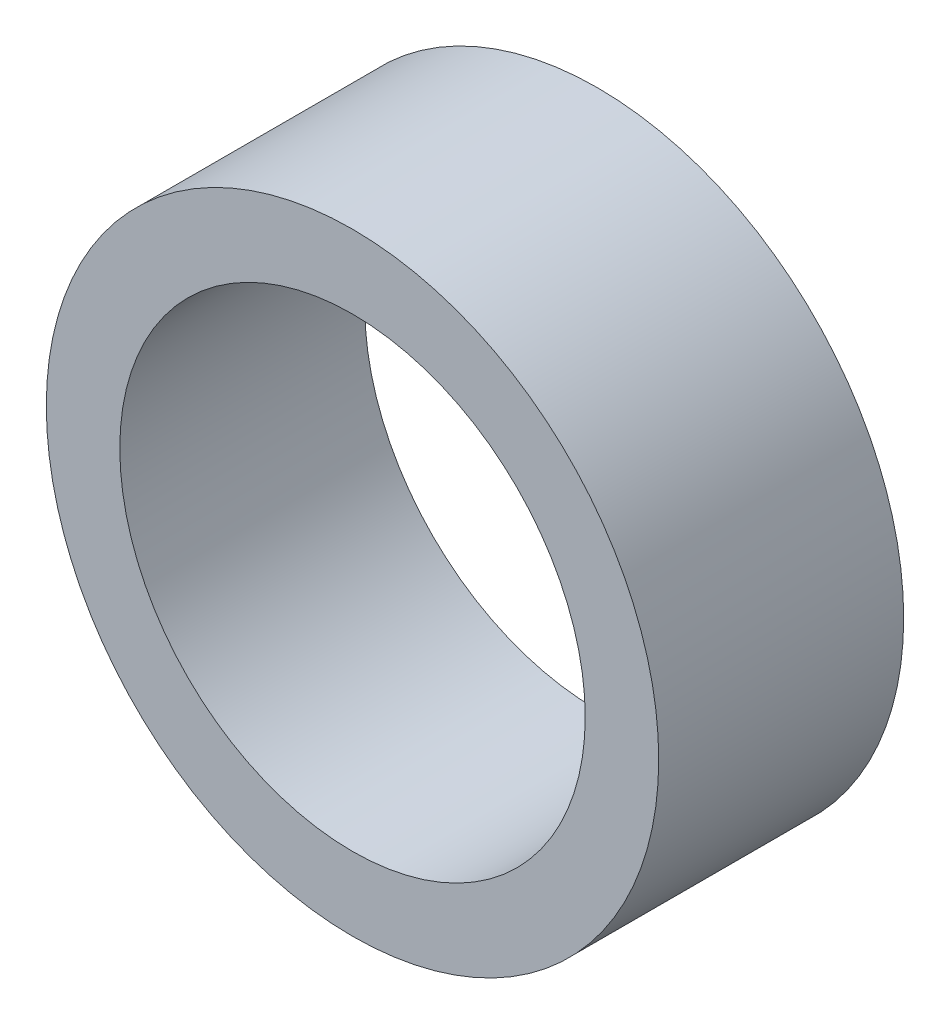
ISO-10303-21;
HEADER;
FILE_DESCRIPTION(('STEP AP214'),'2;1');
FILE_NAME('part.step','',(''),(''),'','','');
FILE_SCHEMA(('AUTOMOTIVE_DESIGN { 1 0 10303 214 1 1 1 1 }'));
ENDSEC;
DATA;
#1=APPLICATION_CONTEXT('core data for automotive mechanical design processes');
#2=APPLICATION_PROTOCOL_DEFINITION('international standard','automotive_design',2000,#1);
#3=PRODUCT_CONTEXT('',#1,'mechanical');
#4=PRODUCT('Part','Part','',(#3));
#5=PRODUCT_RELATED_PRODUCT_CATEGORY('part','',(#4));
#6=PRODUCT_DEFINITION_FORMATION('','',#4);
#7=PRODUCT_DEFINITION_CONTEXT('part definition',#1,'design');
#8=PRODUCT_DEFINITION('design','',#6,#7);
#9=PRODUCT_DEFINITION_SHAPE('','',#8);
#10=(LENGTH_UNIT() NAMED_UNIT(*) SI_UNIT(.MILLI.,.METRE.));
#11=(NAMED_UNIT(*) PLANE_ANGLE_UNIT() SI_UNIT($,.RADIAN.));
#12=(NAMED_UNIT(*) SI_UNIT($,.STERADIAN.) SOLID_ANGLE_UNIT());
#13=UNCERTAINTY_MEASURE_WITH_UNIT(LENGTH_MEASURE(1.E-05),#10,'distance_accuracy_value','');
#14=(GEOMETRIC_REPRESENTATION_CONTEXT(3) GLOBAL_UNCERTAINTY_ASSIGNED_CONTEXT((#13)) GLOBAL_UNIT_ASSIGNED_CONTEXT((#10,
#11,#12)) REPRESENTATION_CONTEXT('',''));
#15=CARTESIAN_POINT('',(0.,0.,0.));
#16=DIRECTION('',(0.,0.,1.));
#17=DIRECTION('',(1.,0.,0.));
#18=AXIS2_PLACEMENT_3D('',#15,#16,#17);
#19=CARTESIAN_POINT('',(0.,0.,10.));
#20=DIRECTION('',(0.,0.,1.));
#21=DIRECTION('',(1.,0.,0.));
#22=AXIS2_PLACEMENT_3D('',#19,#20,#21);
#23=PLANE('',#22);
#24=CARTESIAN_POINT('',(0.,0.,10.));
#25=DIRECTION('',(0.,0.,1.));
#26=DIRECTION('',(1.,0.,0.));
#27=AXIS2_PLACEMENT_3D('',#24,#25,#26);
#28=CIRCLE('',#27,12.5);
#29=CARTESIAN_POINT('',(12.5,0.,10.));
#30=VERTEX_POINT('',#29);
#31=EDGE_CURVE('E10',#30,#30,#28,.T.);
#32=ORIENTED_EDGE('',*,*,#31,.T.);
#33=EDGE_LOOP('',(#32));
#34=FACE_BOUND('',#33,.T.);
#35=CARTESIAN_POINT('',(0.,0.,10.));
#36=DIRECTION('',(0.,0.,1.));
#37=DIRECTION('',(1.,0.,0.));
#38=AXIS2_PLACEMENT_3D('',#35,#36,#37);
#39=CIRCLE('',#38,9.5);
#40=CARTESIAN_POINT('',(9.5,0.,10.));
#41=VERTEX_POINT('',#40);
#42=EDGE_CURVE('E56',#41,#41,#39,.T.);
#43=ORIENTED_EDGE('',*,*,#42,.F.);
#44=EDGE_LOOP('',(#43));
#45=FACE_BOUND('',#44,.T.);
#46=ADVANCED_FACE('F43',(#34,#45),#23,.T.);
#47=CARTESIAN_POINT('',(0.,0.,0.));
#48=DIRECTION('',(0.,0.,1.));
#49=DIRECTION('',(1.,0.,0.));
#50=AXIS2_PLACEMENT_3D('',#47,#48,#49);
#51=PLANE('',#50);
#52=CARTESIAN_POINT('',(0.,0.,0.));
#53=DIRECTION('',(0.,0.,1.));
#54=DIRECTION('',(1.,0.,0.));
#55=AXIS2_PLACEMENT_3D('',#52,#53,#54);
#56=CIRCLE('',#55,12.5);
#57=CARTESIAN_POINT('',(12.5,0.,0.));
#58=VERTEX_POINT('',#57);
#59=EDGE_CURVE('E47',#58,#58,#56,.T.);
#60=ORIENTED_EDGE('',*,*,#59,.F.);
#61=EDGE_LOOP('',(#60));
#62=FACE_BOUND('',#61,.T.);
#63=CARTESIAN_POINT('',(0.,0.,0.));
#64=DIRECTION('',(0.,0.,1.));
#65=DIRECTION('',(1.,0.,0.));
#66=AXIS2_PLACEMENT_3D('',#63,#64,#65);
#67=CIRCLE('',#66,9.5);
#68=CARTESIAN_POINT('',(9.5,0.,0.));
#69=VERTEX_POINT('',#68);
#70=EDGE_CURVE('E58',#69,#69,#67,.T.);
#71=ORIENTED_EDGE('',*,*,#70,.T.);
#72=EDGE_LOOP('',(#71));
#73=FACE_BOUND('',#72,.T.);
#74=ADVANCED_FACE('F70',(#62,#73),#51,.F.);
#75=CARTESIAN_POINT('',(0.,0.,10.));
#76=DIRECTION('',(0.,0.,-1.));
#77=DIRECTION('',(-1.,0.,0.));
#78=AXIS2_PLACEMENT_3D('',#75,#76,#77);
#79=CYLINDRICAL_SURFACE('',#78,12.5);
#80=ORIENTED_EDGE('',*,*,#31,.F.);
#81=EDGE_LOOP('',(#80));
#82=FACE_BOUND('',#81,.T.);
#83=ORIENTED_EDGE('',*,*,#59,.T.);
#84=EDGE_LOOP('',(#83));
#85=FACE_BOUND('',#84,.T.);
#86=ADVANCED_FACE('F45',(#82,#85),#79,.T.);
#87=CARTESIAN_POINT('',(0.,0.,10.));
#88=DIRECTION('',(0.,0.,-1.));
#89=DIRECTION('',(-1.,0.,0.));
#90=AXIS2_PLACEMENT_3D('',#87,#88,#89);
#91=CYLINDRICAL_SURFACE('',#90,9.5);
#92=ORIENTED_EDGE('',*,*,#42,.T.);
#93=EDGE_LOOP('',(#92));
#94=FACE_BOUND('',#93,.T.);
#95=ORIENTED_EDGE('',*,*,#70,.F.);
#96=EDGE_LOOP('',(#95));
#97=FACE_BOUND('',#96,.T.);
#98=ADVANCED_FACE('F66',(#94,#97),#91,.F.);
#99=CLOSED_SHELL('',(#46,#74,#86,#98));
#100=MANIFOLD_SOLID_BREP('B2',#99);
#101=ADVANCED_BREP_SHAPE_REPRESENTATION('',(#18,#100),#14);
#102=SHAPE_DEFINITION_REPRESENTATION(#9,#101);
ENDSEC;
END-ISO-10303-21;
